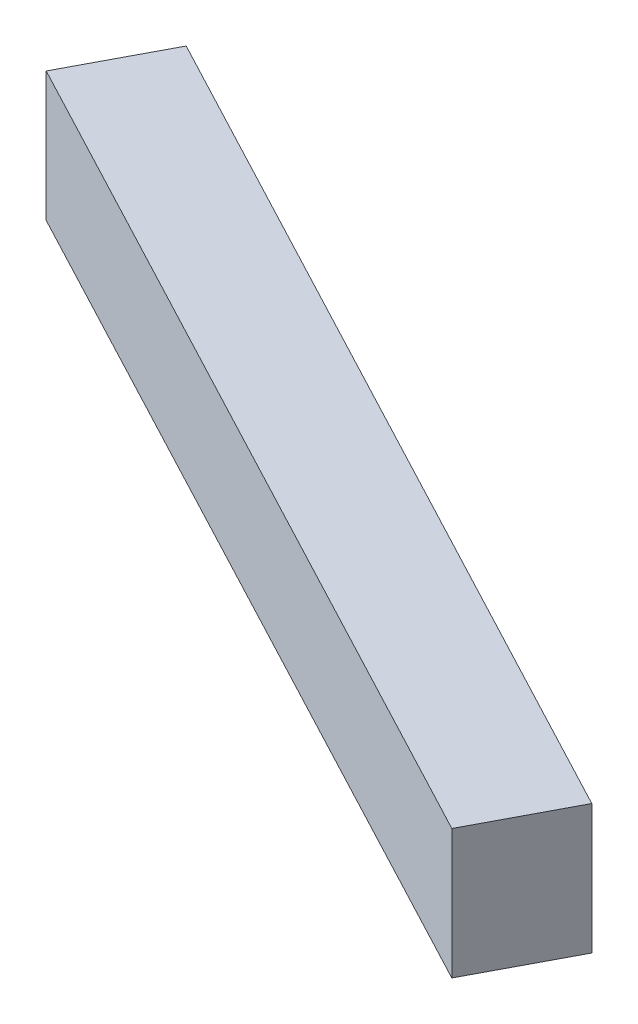
ISO-10303-21;
HEADER;
FILE_DESCRIPTION(('STEP AP214'),'2;1');
FILE_NAME('part.step','',(''),(''),'','','');
FILE_SCHEMA(('AUTOMOTIVE_DESIGN { 1 0 10303 214 1 1 1 1 }'));
ENDSEC;
DATA;
#1=APPLICATION_CONTEXT('core data for automotive mechanical design processes');
#2=APPLICATION_PROTOCOL_DEFINITION('international standard','automotive_design',2000,#1);
#3=PRODUCT_CONTEXT('',#1,'mechanical');
#4=PRODUCT('Part','Part','',(#3));
#5=PRODUCT_RELATED_PRODUCT_CATEGORY('part','',(#4));
#6=PRODUCT_DEFINITION_FORMATION('','',#4);
#7=PRODUCT_DEFINITION_CONTEXT('part definition',#1,'design');
#8=PRODUCT_DEFINITION('design','',#6,#7);
#9=PRODUCT_DEFINITION_SHAPE('','',#8);
#10=(LENGTH_UNIT() NAMED_UNIT(*) SI_UNIT(.MILLI.,.METRE.));
#11=(NAMED_UNIT(*) PLANE_ANGLE_UNIT() SI_UNIT($,.RADIAN.));
#12=(NAMED_UNIT(*) SI_UNIT($,.STERADIAN.) SOLID_ANGLE_UNIT());
#13=UNCERTAINTY_MEASURE_WITH_UNIT(LENGTH_MEASURE(1.E-05),#10,'distance_accuracy_value','');
#14=(GEOMETRIC_REPRESENTATION_CONTEXT(3) GLOBAL_UNCERTAINTY_ASSIGNED_CONTEXT((#13)) GLOBAL_UNIT_ASSIGNED_CONTEXT((#10,
#11,#12)) REPRESENTATION_CONTEXT('',''));
#15=CARTESIAN_POINT('',(0.,0.,0.));
#16=DIRECTION('',(0.,0.,1.));
#17=DIRECTION('',(1.,0.,0.));
#18=AXIS2_PLACEMENT_3D('',#15,#16,#17);
#19=CARTESIAN_POINT('',(-15.9631705890922,7.874,-8.31058739888067));
#20=DIRECTION('',(0.466726260660622,0.,-0.884401830397107));
#21=DIRECTION('',(-0.884401830397107,0.,-0.466726260660622));
#22=AXIS2_PLACEMENT_3D('',#19,#20,#21);
#23=PLANE('',#22);
#24=DIRECTION('',(0.,1.,0.));
#25=VECTOR('',#24,1.);
#26=CARTESIAN_POINT('',(-15.9631705890922,7.874,-8.31058739888067));
#27=LINE('',#26,#25);
#28=CARTESIAN_POINT('',(-15.9631705890922,7.62,-8.31058739888067));
#29=VERTEX_POINT('',#28);
#30=CARTESIAN_POINT('',(-15.9631705890922,7.874,-8.31058739888067));
#31=VERTEX_POINT('',#30);
#32=EDGE_CURVE('E20',#29,#31,#27,.T.);
#33=ORIENTED_EDGE('',*,*,#32,.T.);
#34=DIRECTION('',(0.884401830397098,0.,0.466726260660639));
#35=VECTOR('',#34,1.);
#36=CARTESIAN_POINT('',(-17.6479560759986,7.874,-9.19970092543915));
#37=LINE('',#36,#35);
#38=CARTESIAN_POINT('',(-17.6479560759986,7.874,-9.19970092543914));
#39=VERTEX_POINT('',#38);
#40=EDGE_CURVE('E55',#39,#31,#37,.T.);
#41=ORIENTED_EDGE('',*,*,#40,.F.);
#42=DIRECTION('',(0.,1.,0.));
#43=VECTOR('',#42,1.);
#44=CARTESIAN_POINT('',(-17.6479560759986,7.874,-9.19970092543915));
#45=LINE('',#44,#43);
#46=CARTESIAN_POINT('',(-17.6479560759986,7.62,-9.19970092543914));
#47=VERTEX_POINT('',#46);
#48=EDGE_CURVE('E76',#39,#47,#45,.F.);
#49=ORIENTED_EDGE('',*,*,#48,.T.);
#50=DIRECTION('',(0.884401830397098,0.,0.466726260660639));
#51=VECTOR('',#50,1.);
#52=CARTESIAN_POINT('',(-17.6479560759986,7.62,-9.19970092543915));
#53=LINE('',#52,#51);
#54=EDGE_CURVE('E58',#47,#29,#53,.T.);
#55=ORIENTED_EDGE('',*,*,#54,.T.);
#56=EDGE_LOOP('',(#33,#41,#49,#55));
#57=FACE_BOUND('',#56,.T.);
#58=ADVANCED_FACE('F17',(#57),#23,.F.);
#59=CARTESIAN_POINT('',(-15.9631705890922,7.874,-8.31058739888067));
#60=DIRECTION('',(-0.884401830397123,0.,-0.466726260660592));
#61=DIRECTION('',(-0.466726260660592,0.,0.884401830397123));
#62=AXIS2_PLACEMENT_3D('',#59,#60,#61);
#63=PLANE('',#62);
#64=DIRECTION('',(0.,1.,0.));
#65=VECTOR('',#64,1.);
#66=CARTESIAN_POINT('',(-15.8683318129259,7.874,-8.49029785081737));
#67=LINE('',#66,#65);
#68=CARTESIAN_POINT('',(-15.8683318129259,7.62,-8.49029785081738));
#69=VERTEX_POINT('',#68);
#70=CARTESIAN_POINT('',(-15.8683318129259,7.874,-8.49029785081738));
#71=VERTEX_POINT('',#70);
#72=EDGE_CURVE('E73',#69,#71,#67,.T.);
#73=ORIENTED_EDGE('',*,*,#72,.T.);
#74=DIRECTION('',(0.466726260660849,0.,-0.884401830396987));
#75=VECTOR('',#74,1.);
#76=CARTESIAN_POINT('',(-15.9631705890922,7.874,-8.31058739888067));
#77=LINE('',#76,#75);
#78=EDGE_CURVE('E63',#31,#71,#77,.T.);
#79=ORIENTED_EDGE('',*,*,#78,.F.);
#80=ORIENTED_EDGE('',*,*,#32,.F.);
#81=DIRECTION('',(0.466726260660849,0.,-0.884401830396987));
#82=VECTOR('',#81,1.);
#83=CARTESIAN_POINT('',(-15.9631705890922,7.62,-8.31058739888067));
#84=LINE('',#83,#82);
#85=EDGE_CURVE('E80',#29,#69,#84,.T.);
#86=ORIENTED_EDGE('',*,*,#85,.T.);
#87=EDGE_LOOP('',(#73,#79,#80,#86));
#88=FACE_BOUND('',#87,.T.);
#89=ADVANCED_FACE('F72',(#88),#63,.F.);
#90=CARTESIAN_POINT('',(-15.8683318129259,7.874,-8.49029785081737));
#91=DIRECTION('',(0.,1.,0.));
#92=DIRECTION('',(0.,0.,1.));
#93=AXIS2_PLACEMENT_3D('',#90,#91,#92);
#94=PLANE('',#93);
#95=DIRECTION('',(0.466726259314273,0.,-0.884401831107617));
#96=VECTOR('',#95,1.);
#97=CARTESIAN_POINT('',(-17.6479560759986,7.874,-9.19970092543915));
#98=LINE('',#97,#96);
#99=CARTESIAN_POINT('',(-17.553117300106,7.874,-9.37941137752023));
#100=VERTEX_POINT('',#99);
#101=EDGE_CURVE('E69',#100,#39,#98,.F.);
#102=ORIENTED_EDGE('',*,*,#101,.T.);
#103=ORIENTED_EDGE('',*,*,#40,.T.);
#104=ORIENTED_EDGE('',*,*,#78,.T.);
#105=DIRECTION('',(0.884401830397107,0.,0.466726260660621));
#106=VECTOR('',#105,1.);
#107=CARTESIAN_POINT('',(-15.8683318129259,7.874,-8.49029785081737));
#108=LINE('',#107,#106);
#109=EDGE_CURVE('E83',#71,#100,#108,.F.);
#110=ORIENTED_EDGE('',*,*,#109,.T.);
#111=EDGE_LOOP('',(#102,#103,#104,#110));
#112=FACE_BOUND('',#111,.T.);
#113=ADVANCED_FACE('F66',(#112),#94,.T.);
#114=CARTESIAN_POINT('',(-17.6479560759986,7.874,-9.19970092543915));
#115=DIRECTION('',(0.884401831107617,0.,0.466726259314273));
#116=DIRECTION('',(0.466726259314273,0.,-0.884401831107617));
#117=AXIS2_PLACEMENT_3D('',#114,#115,#116);
#118=PLANE('',#117);
#119=ORIENTED_EDGE('',*,*,#48,.F.);
#120=ORIENTED_EDGE('',*,*,#101,.F.);
#121=DIRECTION('',(0.,1.,0.));
#122=VECTOR('',#121,1.);
#123=CARTESIAN_POINT('',(-17.553117300106,7.874,-9.37941137752024));
#124=LINE('',#123,#122);
#125=CARTESIAN_POINT('',(-17.553117300106,7.62,-9.37941137752022));
#126=VERTEX_POINT('',#125);
#127=EDGE_CURVE('E26',#100,#126,#124,.F.);
#128=ORIENTED_EDGE('',*,*,#127,.T.);
#129=DIRECTION('',(-0.466726259314015,0.,0.884401831107753));
#130=VECTOR('',#129,1.);
#131=CARTESIAN_POINT('',(-17.553117300106,7.62,-9.37941137752023));
#132=LINE('',#131,#130);
#133=EDGE_CURVE('E34',#126,#47,#132,.T.);
#134=ORIENTED_EDGE('',*,*,#133,.T.);
#135=EDGE_LOOP('',(#119,#120,#128,#134));
#136=FACE_BOUND('',#135,.T.);
#137=ADVANCED_FACE('F88',(#136),#118,.F.);
#138=CARTESIAN_POINT('',(-15.8683318129259,7.62,-8.49029785081737));
#139=DIRECTION('',(0.,1.,0.));
#140=DIRECTION('',(0.,0.,1.));
#141=AXIS2_PLACEMENT_3D('',#138,#139,#140);
#142=PLANE('',#141);
#143=ORIENTED_EDGE('',*,*,#54,.F.);
#144=ORIENTED_EDGE('',*,*,#133,.F.);
#145=DIRECTION('',(0.884401830397107,0.,0.466726260660621));
#146=VECTOR('',#145,1.);
#147=CARTESIAN_POINT('',(-15.8683318129259,7.62,-8.49029785081737));
#148=LINE('',#147,#146);
#149=EDGE_CURVE('E11',#126,#69,#148,.T.);
#150=ORIENTED_EDGE('',*,*,#149,.T.);
#151=ORIENTED_EDGE('',*,*,#85,.F.);
#152=EDGE_LOOP('',(#143,#144,#150,#151));
#153=FACE_BOUND('',#152,.T.);
#154=ADVANCED_FACE('F91',(#153),#142,.F.);
#155=CARTESIAN_POINT('',(-15.8683318129259,7.874,-8.49029785081737));
#156=DIRECTION('',(-0.466726260660621,0.,0.884401830397107));
#157=DIRECTION('',(0.884401830397107,0.,0.466726260660621));
#158=AXIS2_PLACEMENT_3D('',#155,#156,#157);
#159=PLANE('',#158);
#160=ORIENTED_EDGE('',*,*,#127,.F.);
#161=ORIENTED_EDGE('',*,*,#109,.F.);
#162=ORIENTED_EDGE('',*,*,#72,.F.);
#163=ORIENTED_EDGE('',*,*,#149,.F.);
#164=EDGE_LOOP('',(#160,#161,#162,#163));
#165=FACE_BOUND('',#164,.T.);
#166=ADVANCED_FACE('F90',(#165),#159,.F.);
#167=CLOSED_SHELL('',(#58,#89,#113,#137,#154,#166));
#168=MANIFOLD_SOLID_BREP('B1',#167);
#169=ADVANCED_BREP_SHAPE_REPRESENTATION('',(#18,#168),#14);
#170=SHAPE_DEFINITION_REPRESENTATION(#9,#169);
ENDSEC;
END-ISO-10303-21;
